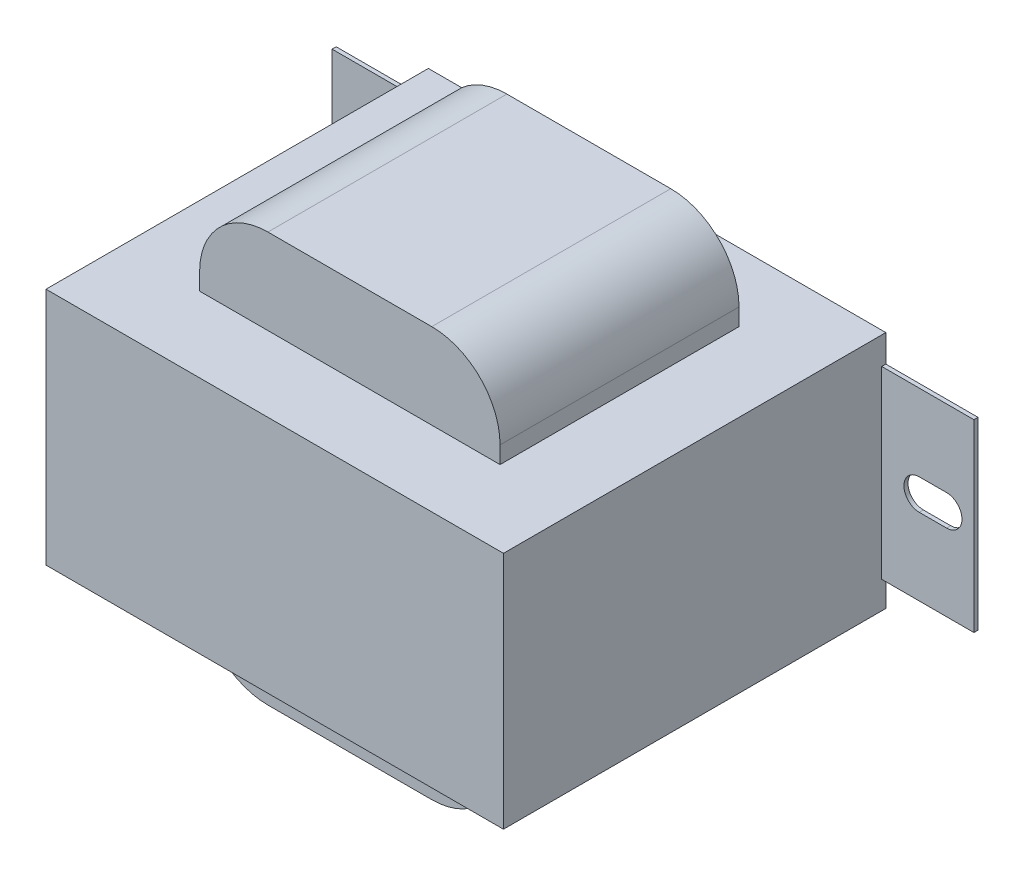
ISO-10303-21;
HEADER;
FILE_DESCRIPTION(('STEP AP214'),'2;1');
FILE_NAME('part.step','',(''),(''),'','','');
FILE_SCHEMA(('AUTOMOTIVE_DESIGN { 1 0 10303 214 1 1 1 1 }'));
ENDSEC;
DATA;
#1=APPLICATION_CONTEXT('core data for automotive mechanical design processes');
#2=APPLICATION_PROTOCOL_DEFINITION('international standard','automotive_design',2000,#1);
#3=PRODUCT_CONTEXT('',#1,'mechanical');
#4=PRODUCT('Part','Part','',(#3));
#5=PRODUCT_RELATED_PRODUCT_CATEGORY('part','',(#4));
#6=PRODUCT_DEFINITION_FORMATION('','',#4);
#7=PRODUCT_DEFINITION_CONTEXT('part definition',#1,'design');
#8=PRODUCT_DEFINITION('design','',#6,#7);
#9=PRODUCT_DEFINITION_SHAPE('','',#8);
#10=(LENGTH_UNIT() NAMED_UNIT(*) SI_UNIT(.MILLI.,.METRE.));
#11=(NAMED_UNIT(*) PLANE_ANGLE_UNIT() SI_UNIT($,.RADIAN.));
#12=(NAMED_UNIT(*) SI_UNIT($,.STERADIAN.) SOLID_ANGLE_UNIT());
#13=UNCERTAINTY_MEASURE_WITH_UNIT(LENGTH_MEASURE(1.E-05),#10,'distance_accuracy_value','');
#14=(GEOMETRIC_REPRESENTATION_CONTEXT(3) GLOBAL_UNCERTAINTY_ASSIGNED_CONTEXT((#13)) GLOBAL_UNIT_ASSIGNED_CONTEXT((#10,
#11,#12)) REPRESENTATION_CONTEXT('',''));
#15=CARTESIAN_POINT('',(0.,0.,0.));
#16=DIRECTION('',(0.,0.,1.));
#17=DIRECTION('',(1.,0.,0.));
#18=AXIS2_PLACEMENT_3D('',#15,#16,#17);
#19=CARTESIAN_POINT('',(-33.5,17.5,56.));
#20=DIRECTION('',(1.,0.,0.));
#21=DIRECTION('',(0.,1.,0.));
#22=AXIS2_PLACEMENT_3D('',#19,#20,#21);
#23=PLANE('',#22);
#24=DIRECTION('',(0.,0.,-1.));
#25=VECTOR('',#24,1.);
#26=CARTESIAN_POINT('',(-33.5,13.5,0.6));
#27=LINE('',#26,#25);
#28=CARTESIAN_POINT('',(-33.5,13.5,0.6));
#29=VERTEX_POINT('',#28);
#30=CARTESIAN_POINT('',(-33.5,13.5,0.));
#31=VERTEX_POINT('',#30);
#32=EDGE_CURVE('E299',#29,#31,#27,.T.);
#33=ORIENTED_EDGE('',*,*,#32,.F.);
#34=DIRECTION('',(0.,-1.,0.));
#35=VECTOR('',#34,1.);
#36=CARTESIAN_POINT('',(-33.5,13.5,0.6));
#37=LINE('',#36,#35);
#38=CARTESIAN_POINT('',(-33.5,-13.5,0.6));
#39=VERTEX_POINT('',#38);
#40=EDGE_CURVE('E289',#29,#39,#37,.T.);
#41=ORIENTED_EDGE('',*,*,#40,.T.);
#42=DIRECTION('',(0.,0.,-1.));
#43=VECTOR('',#42,1.);
#44=CARTESIAN_POINT('',(-33.5,-13.5,0.6));
#45=LINE('',#44,#43);
#46=CARTESIAN_POINT('',(-33.5,-13.5,0.));
#47=VERTEX_POINT('',#46);
#48=EDGE_CURVE('E307',#39,#47,#45,.T.);
#49=ORIENTED_EDGE('',*,*,#48,.T.);
#50=DIRECTION('',(0.,-1.,0.));
#51=VECTOR('',#50,1.);
#52=CARTESIAN_POINT('',(-33.5,17.5,0.));
#53=LINE('',#52,#51);
#54=CARTESIAN_POINT('',(-33.5,-17.5,0.));
#55=VERTEX_POINT('',#54);
#56=EDGE_CURVE('E327',#47,#55,#53,.T.);
#57=ORIENTED_EDGE('',*,*,#56,.T.);
#58=DIRECTION('',(0.,0.,-1.));
#59=VECTOR('',#58,1.);
#60=CARTESIAN_POINT('',(-33.5,-17.5,56.));
#61=LINE('',#60,#59);
#62=CARTESIAN_POINT('',(-33.5,-17.5,56.));
#63=VERTEX_POINT('',#62);
#64=EDGE_CURVE('E360',#63,#55,#61,.T.);
#65=ORIENTED_EDGE('',*,*,#64,.F.);
#66=DIRECTION('',(0.,-1.,0.));
#67=VECTOR('',#66,1.);
#68=CARTESIAN_POINT('',(-33.5,17.5,56.));
#69=LINE('',#68,#67);
#70=CARTESIAN_POINT('',(-33.5,17.5,56.));
#71=VERTEX_POINT('',#70);
#72=EDGE_CURVE('E377',#71,#63,#69,.T.);
#73=ORIENTED_EDGE('',*,*,#72,.F.);
#74=DIRECTION('',(0.,0.,-1.));
#75=VECTOR('',#74,1.);
#76=CARTESIAN_POINT('',(-33.5,17.5,56.));
#77=LINE('',#76,#75);
#78=CARTESIAN_POINT('',(-33.5,17.5,0.));
#79=VERTEX_POINT('',#78);
#80=EDGE_CURVE('E369',#71,#79,#77,.T.);
#81=ORIENTED_EDGE('',*,*,#80,.T.);
#82=EDGE_CURVE('E330',#79,#31,#53,.T.);
#83=ORIENTED_EDGE('',*,*,#82,.T.);
#84=EDGE_LOOP('',(#33,#41,#49,#57,#65,#73,#81,#83));
#85=FACE_BOUND('',#84,.T.);
#86=ADVANCED_FACE('F33',(#85),#23,.F.);
#87=CARTESIAN_POINT('',(33.5,17.5,56.));
#88=DIRECTION('',(-1.,0.,0.));
#89=DIRECTION('',(0.,0.,1.));
#90=AXIS2_PLACEMENT_3D('',#87,#88,#89);
#91=PLANE('',#90);
#92=DIRECTION('',(0.,0.,-1.));
#93=VECTOR('',#92,1.);
#94=CARTESIAN_POINT('',(33.5,-13.5,0.6));
#95=LINE('',#94,#93);
#96=CARTESIAN_POINT('',(33.5,-13.5,0.6));
#97=VERTEX_POINT('',#96);
#98=CARTESIAN_POINT('',(33.5,-13.5,0.));
#99=VERTEX_POINT('',#98);
#100=EDGE_CURVE('E831',#97,#99,#95,.T.);
#101=ORIENTED_EDGE('',*,*,#100,.F.);
#102=DIRECTION('',(0.,1.,0.));
#103=VECTOR('',#102,1.);
#104=CARTESIAN_POINT('',(33.5,13.5,0.6));
#105=LINE('',#104,#103);
#106=CARTESIAN_POINT('',(33.5,13.5,0.6));
#107=VERTEX_POINT('',#106);
#108=EDGE_CURVE('E864',#97,#107,#105,.T.);
#109=ORIENTED_EDGE('',*,*,#108,.T.);
#110=DIRECTION('',(0.,0.,-1.));
#111=VECTOR('',#110,1.);
#112=CARTESIAN_POINT('',(33.5,13.5,0.6));
#113=LINE('',#112,#111);
#114=CARTESIAN_POINT('',(33.5,13.5,0.));
#115=VERTEX_POINT('',#114);
#116=EDGE_CURVE('E853',#107,#115,#113,.T.);
#117=ORIENTED_EDGE('',*,*,#116,.T.);
#118=DIRECTION('',(0.,1.,0.));
#119=VECTOR('',#118,1.);
#120=CARTESIAN_POINT('',(33.5,17.5,0.));
#121=LINE('',#120,#119);
#122=CARTESIAN_POINT('',(33.5,17.5,0.));
#123=VERTEX_POINT('',#122);
#124=EDGE_CURVE('E340',#115,#123,#121,.T.);
#125=ORIENTED_EDGE('',*,*,#124,.T.);
#126=DIRECTION('',(0.,0.,-1.));
#127=VECTOR('',#126,1.);
#128=CARTESIAN_POINT('',(33.5,17.5,56.));
#129=LINE('',#128,#127);
#130=CARTESIAN_POINT('',(33.5,17.5,56.));
#131=VERTEX_POINT('',#130);
#132=EDGE_CURVE('E366',#131,#123,#129,.T.);
#133=ORIENTED_EDGE('',*,*,#132,.F.);
#134=DIRECTION('',(0.,1.,0.));
#135=VECTOR('',#134,1.);
#136=CARTESIAN_POINT('',(33.5,17.5,56.));
#137=LINE('',#136,#135);
#138=CARTESIAN_POINT('',(33.5,-17.5,56.));
#139=VERTEX_POINT('',#138);
#140=EDGE_CURVE('E374',#139,#131,#137,.T.);
#141=ORIENTED_EDGE('',*,*,#140,.F.);
#142=DIRECTION('',(0.,0.,-1.));
#143=VECTOR('',#142,1.);
#144=CARTESIAN_POINT('',(33.5,-17.5,56.));
#145=LINE('',#144,#143);
#146=CARTESIAN_POINT('',(33.5,-17.5,0.));
#147=VERTEX_POINT('',#146);
#148=EDGE_CURVE('E363',#139,#147,#145,.T.);
#149=ORIENTED_EDGE('',*,*,#148,.T.);
#150=EDGE_CURVE('E349',#147,#99,#121,.T.);
#151=ORIENTED_EDGE('',*,*,#150,.T.);
#152=EDGE_LOOP('',(#101,#109,#117,#125,#133,#141,#149,#151));
#153=FACE_BOUND('',#152,.T.);
#154=ADVANCED_FACE('F419',(#153),#91,.F.);
#155=CARTESIAN_POINT('',(-33.5,-17.5,56.));
#156=DIRECTION('',(0.,1.,0.));
#157=DIRECTION('',(-1.,0.,0.));
#158=AXIS2_PLACEMENT_3D('',#155,#156,#157);
#159=PLANE('',#158);
#160=DIRECTION('',(1.,0.,0.));
#161=VECTOR('',#160,1.);
#162=CARTESIAN_POINT('',(-33.5,-17.5,0.));
#163=LINE('',#162,#161);
#164=EDGE_CURVE('E337',#55,#147,#163,.T.);
#165=ORIENTED_EDGE('',*,*,#164,.T.);
#166=ORIENTED_EDGE('',*,*,#148,.F.);
#167=DIRECTION('',(1.,0.,0.));
#168=VECTOR('',#167,1.);
#169=CARTESIAN_POINT('',(-33.5,-17.5,56.));
#170=LINE('',#169,#168);
#171=EDGE_CURVE('E376',#63,#139,#170,.T.);
#172=ORIENTED_EDGE('',*,*,#171,.F.);
#173=ORIENTED_EDGE('',*,*,#64,.T.);
#174=EDGE_LOOP('',(#165,#166,#172,#173));
#175=FACE_BOUND('',#174,.T.);
#176=DIRECTION('',(1.,0.,0.));
#177=VECTOR('',#176,1.);
#178=CARTESIAN_POINT('',(-33.5,-17.5,9.99999999999999));
#179=LINE('',#178,#177);
#180=CARTESIAN_POINT('',(-22.,-17.5,9.99999999999999));
#181=VERTEX_POINT('',#180);
#182=CARTESIAN_POINT('',(22.,-17.5,9.99999999999999));
#183=VERTEX_POINT('',#182);
#184=EDGE_CURVE('E803',#181,#183,#179,.T.);
#185=ORIENTED_EDGE('',*,*,#184,.F.);
#186=DIRECTION('',(0.,0.,1.));
#187=VECTOR('',#186,1.);
#188=CARTESIAN_POINT('',(-22.,-17.5,56.));
#189=LINE('',#188,#187);
#190=CARTESIAN_POINT('',(-22.,-17.5,45.));
#191=VERTEX_POINT('',#190);
#192=EDGE_CURVE('E804',#181,#191,#189,.T.);
#193=ORIENTED_EDGE('',*,*,#192,.T.);
#194=DIRECTION('',(1.,0.,0.));
#195=VECTOR('',#194,1.);
#196=CARTESIAN_POINT('',(-33.5,-17.5,45.));
#197=LINE('',#196,#195);
#198=CARTESIAN_POINT('',(22.,-17.5,45.));
#199=VERTEX_POINT('',#198);
#200=EDGE_CURVE('E786',#191,#199,#197,.T.);
#201=ORIENTED_EDGE('',*,*,#200,.T.);
#202=DIRECTION('',(0.,0.,-1.));
#203=VECTOR('',#202,1.);
#204=CARTESIAN_POINT('',(22.,-17.5,56.));
#205=LINE('',#204,#203);
#206=EDGE_CURVE('E331',#199,#183,#205,.T.);
#207=ORIENTED_EDGE('',*,*,#206,.T.);
#208=EDGE_LOOP('',(#185,#193,#201,#207));
#209=FACE_BOUND('',#208,.T.);
#210=ADVANCED_FACE('F423',(#175,#209),#159,.F.);
#211=CARTESIAN_POINT('',(-33.5,17.5,56.));
#212=DIRECTION('',(0.,-1.,0.));
#213=DIRECTION('',(0.,0.,-1.));
#214=AXIS2_PLACEMENT_3D('',#211,#212,#213);
#215=PLANE('',#214);
#216=DIRECTION('',(-1.,0.,0.));
#217=VECTOR('',#216,1.);
#218=CARTESIAN_POINT('',(-33.5,17.5,0.));
#219=LINE('',#218,#217);
#220=EDGE_CURVE('E343',#123,#79,#219,.T.);
#221=ORIENTED_EDGE('',*,*,#220,.T.);
#222=ORIENTED_EDGE('',*,*,#80,.F.);
#223=DIRECTION('',(-1.,0.,0.));
#224=VECTOR('',#223,1.);
#225=CARTESIAN_POINT('',(-33.5,17.5,56.));
#226=LINE('',#225,#224);
#227=EDGE_CURVE('E372',#131,#71,#226,.T.);
#228=ORIENTED_EDGE('',*,*,#227,.F.);
#229=ORIENTED_EDGE('',*,*,#132,.T.);
#230=EDGE_LOOP('',(#221,#222,#228,#229));
#231=FACE_BOUND('',#230,.T.);
#232=DIRECTION('',(-1.,0.,0.));
#233=VECTOR('',#232,1.);
#234=CARTESIAN_POINT('',(-33.5,17.5,9.99999999999999));
#235=LINE('',#234,#233);
#236=CARTESIAN_POINT('',(22.,17.5,9.99999999999999));
#237=VERTEX_POINT('',#236);
#238=CARTESIAN_POINT('',(-22.,17.5,9.99999999999999));
#239=VERTEX_POINT('',#238);
#240=EDGE_CURVE('E11',#237,#239,#235,.T.);
#241=ORIENTED_EDGE('',*,*,#240,.F.);
#242=DIRECTION('',(0.,0.,1.));
#243=VECTOR('',#242,1.);
#244=CARTESIAN_POINT('',(22.,17.5,56.));
#245=LINE('',#244,#243);
#246=CARTESIAN_POINT('',(22.,17.5,45.));
#247=VERTEX_POINT('',#246);
#248=EDGE_CURVE('E41',#237,#247,#245,.T.);
#249=ORIENTED_EDGE('',*,*,#248,.T.);
#250=DIRECTION('',(-1.,0.,0.));
#251=VECTOR('',#250,1.);
#252=CARTESIAN_POINT('',(-33.5,17.5,45.));
#253=LINE('',#252,#251);
#254=CARTESIAN_POINT('',(-22.,17.5,45.));
#255=VERTEX_POINT('',#254);
#256=EDGE_CURVE('E357',#247,#255,#253,.T.);
#257=ORIENTED_EDGE('',*,*,#256,.T.);
#258=DIRECTION('',(0.,0.,-1.));
#259=VECTOR('',#258,1.);
#260=CARTESIAN_POINT('',(-22.,17.5,56.));
#261=LINE('',#260,#259);
#262=EDGE_CURVE('E354',#255,#239,#261,.T.);
#263=ORIENTED_EDGE('',*,*,#262,.T.);
#264=EDGE_LOOP('',(#241,#249,#257,#263));
#265=FACE_BOUND('',#264,.T.);
#266=ADVANCED_FACE('F385',(#231,#265),#215,.F.);
#267=CARTESIAN_POINT('',(-33.5,-17.5,56.));
#268=DIRECTION('',(0.,0.,1.));
#269=DIRECTION('',(1.,0.,0.));
#270=AXIS2_PLACEMENT_3D('',#267,#268,#269);
#271=PLANE('',#270);
#272=ORIENTED_EDGE('',*,*,#72,.T.);
#273=ORIENTED_EDGE('',*,*,#171,.T.);
#274=ORIENTED_EDGE('',*,*,#140,.T.);
#275=ORIENTED_EDGE('',*,*,#227,.T.);
#276=EDGE_LOOP('',(#272,#273,#274,#275));
#277=FACE_BOUND('',#276,.T.);
#278=ADVANCED_FACE('F396',(#277),#271,.T.);
#279=CARTESIAN_POINT('',(-33.5,-17.5,0.));
#280=DIRECTION('',(0.,0.,1.));
#281=DIRECTION('',(1.,0.,0.));
#282=AXIS2_PLACEMENT_3D('',#279,#280,#281);
#283=PLANE('',#282);
#284=ORIENTED_EDGE('',*,*,#82,.F.);
#285=ORIENTED_EDGE('',*,*,#220,.F.);
#286=ORIENTED_EDGE('',*,*,#124,.F.);
#287=DIRECTION('',(1.,0.,0.));
#288=VECTOR('',#287,1.);
#289=CARTESIAN_POINT('',(33.5,13.5,0.));
#290=LINE('',#289,#288);
#291=CARTESIAN_POINT('',(47.,13.5,0.));
#292=VERTEX_POINT('',#291);
#293=EDGE_CURVE('E57',#115,#292,#290,.T.);
#294=ORIENTED_EDGE('',*,*,#293,.T.);
#295=DIRECTION('',(0.,-1.,0.));
#296=VECTOR('',#295,1.);
#297=CARTESIAN_POINT('',(47.,13.5,0.));
#298=LINE('',#297,#296);
#299=CARTESIAN_POINT('',(47.,-13.5,0.));
#300=VERTEX_POINT('',#299);
#301=EDGE_CURVE('E865',#292,#300,#298,.T.);
#302=ORIENTED_EDGE('',*,*,#301,.T.);
#303=DIRECTION('',(-1.,0.,0.));
#304=VECTOR('',#303,1.);
#305=CARTESIAN_POINT('',(33.5,-13.5,0.));
#306=LINE('',#305,#304);
#307=EDGE_CURVE('E862',#300,#99,#306,.T.);
#308=ORIENTED_EDGE('',*,*,#307,.T.);
#309=ORIENTED_EDGE('',*,*,#150,.F.);
#310=ORIENTED_EDGE('',*,*,#164,.F.);
#311=ORIENTED_EDGE('',*,*,#56,.F.);
#312=DIRECTION('',(-1.,0.,0.));
#313=VECTOR('',#312,1.);
#314=CARTESIAN_POINT('',(-33.5,-13.5,0.));
#315=LINE('',#314,#313);
#316=CARTESIAN_POINT('',(-47.,-13.5,0.));
#317=VERTEX_POINT('',#316);
#318=EDGE_CURVE('E49',#47,#317,#315,.T.);
#319=ORIENTED_EDGE('',*,*,#318,.T.);
#320=DIRECTION('',(0.,1.,0.));
#321=VECTOR('',#320,1.);
#322=CARTESIAN_POINT('',(-47.,13.5,0.));
#323=LINE('',#322,#321);
#324=CARTESIAN_POINT('',(-47.,13.5,0.));
#325=VERTEX_POINT('',#324);
#326=EDGE_CURVE('E290',#317,#325,#323,.T.);
#327=ORIENTED_EDGE('',*,*,#326,.T.);
#328=DIRECTION('',(1.,0.,0.));
#329=VECTOR('',#328,1.);
#330=CARTESIAN_POINT('',(-33.5,13.5,0.));
#331=LINE('',#330,#329);
#332=EDGE_CURVE('E282',#325,#31,#331,.T.);
#333=ORIENTED_EDGE('',*,*,#332,.T.);
#334=EDGE_LOOP('',(#284,#285,#286,#294,#302,#308,#309,#310,#311,#319,#327,#333));
#335=FACE_BOUND('',#334,.T.);
#336=DIRECTION('',(-1.,0.,0.));
#337=VECTOR('',#336,1.);
#338=CARTESIAN_POINT('',(43.,-2.25000000000002,0.));
#339=LINE('',#338,#337);
#340=CARTESIAN_POINT('',(43.,-2.25000000000002,0.));
#341=VERTEX_POINT('',#340);
#342=CARTESIAN_POINT('',(39.,-2.24999999999999,0.));
#343=VERTEX_POINT('',#342);
#344=EDGE_CURVE('E403',#341,#343,#339,.T.);
#345=ORIENTED_EDGE('',*,*,#344,.F.);
#346=CARTESIAN_POINT('',(43.,0.,0.));
#347=DIRECTION('',(0.,0.,-1.));
#348=DIRECTION('',(-1.,0.,0.));
#349=AXIS2_PLACEMENT_3D('',#346,#347,#348);
#350=CIRCLE('',#349,2.25);
#351=CARTESIAN_POINT('',(43.,2.24999999999998,0.));
#352=VERTEX_POINT('',#351);
#353=EDGE_CURVE('E304',#352,#341,#350,.T.);
#354=ORIENTED_EDGE('',*,*,#353,.F.);
#355=DIRECTION('',(1.,0.,0.));
#356=VECTOR('',#355,1.);
#357=CARTESIAN_POINT('',(43.,2.24999999999998,0.));
#358=LINE('',#357,#356);
#359=CARTESIAN_POINT('',(39.,2.24999999999999,0.));
#360=VERTEX_POINT('',#359);
#361=EDGE_CURVE('E898',#360,#352,#358,.T.);
#362=ORIENTED_EDGE('',*,*,#361,.F.);
#363=CARTESIAN_POINT('',(39.,0.,0.));
#364=DIRECTION('',(0.,0.,-1.));
#365=DIRECTION('',(-1.,0.,0.));
#366=AXIS2_PLACEMENT_3D('',#363,#364,#365);
#367=CIRCLE('',#366,2.24999999999999);
#368=EDGE_CURVE('E901',#343,#360,#367,.T.);
#369=ORIENTED_EDGE('',*,*,#368,.F.);
#370=EDGE_LOOP('',(#345,#354,#362,#369));
#371=FACE_BOUND('',#370,.T.);
#372=DIRECTION('',(1.,0.,0.));
#373=VECTOR('',#372,1.);
#374=CARTESIAN_POINT('',(-43.,2.25000000000001,0.));
#375=LINE('',#374,#373);
#376=CARTESIAN_POINT('',(-43.,2.25000000000001,0.));
#377=VERTEX_POINT('',#376);
#378=CARTESIAN_POINT('',(-39.,2.25000000000001,0.));
#379=VERTEX_POINT('',#378);
#380=EDGE_CURVE('E276',#377,#379,#375,.T.);
#381=ORIENTED_EDGE('',*,*,#380,.F.);
#382=CARTESIAN_POINT('',(-43.,0.,0.));
#383=DIRECTION('',(0.,0.,-1.));
#384=DIRECTION('',(1.,0.,0.));
#385=AXIS2_PLACEMENT_3D('',#382,#383,#384);
#386=CIRCLE('',#385,2.25);
#387=CARTESIAN_POINT('',(-43.,-2.24999999999999,0.));
#388=VERTEX_POINT('',#387);
#389=EDGE_CURVE('E249',#388,#377,#386,.T.);
#390=ORIENTED_EDGE('',*,*,#389,.F.);
#391=DIRECTION('',(-1.,0.,0.));
#392=VECTOR('',#391,1.);
#393=CARTESIAN_POINT('',(-43.,-2.24999999999999,0.));
#394=LINE('',#393,#392);
#395=CARTESIAN_POINT('',(-39.,-2.24999999999999,0.));
#396=VERTEX_POINT('',#395);
#397=EDGE_CURVE('E267',#396,#388,#394,.T.);
#398=ORIENTED_EDGE('',*,*,#397,.F.);
#399=CARTESIAN_POINT('',(-39.,0.,0.));
#400=DIRECTION('',(0.,0.,-1.));
#401=DIRECTION('',(1.,0.,0.));
#402=AXIS2_PLACEMENT_3D('',#399,#400,#401);
#403=CIRCLE('',#402,2.25);
#404=EDGE_CURVE('E270',#379,#396,#403,.T.);
#405=ORIENTED_EDGE('',*,*,#404,.F.);
#406=EDGE_LOOP('',(#381,#390,#398,#405));
#407=FACE_BOUND('',#406,.T.);
#408=ADVANCED_FACE('F392',(#335,#371,#407),#283,.F.);
#409=CARTESIAN_POINT('',(-12.,20.,9.99999999999999));
#410=DIRECTION('',(0.,0.,1.));
#411=DIRECTION('',(1.,0.,0.));
#412=AXIS2_PLACEMENT_3D('',#409,#410,#411);
#413=CYLINDRICAL_SURFACE('',#412,9.99999999999999);
#414=CARTESIAN_POINT('',(-12.,20.,45.));
#415=DIRECTION('',(0.,0.,1.));
#416=DIRECTION('',(1.,0.,0.));
#417=AXIS2_PLACEMENT_3D('',#414,#415,#416);
#418=CIRCLE('',#417,9.99999999999999);
#419=CARTESIAN_POINT('',(-12.,30.,45.));
#420=VERTEX_POINT('',#419);
#421=CARTESIAN_POINT('',(-22.,20.,45.));
#422=VERTEX_POINT('',#421);
#423=EDGE_CURVE('E829',#420,#422,#418,.T.);
#424=ORIENTED_EDGE('',*,*,#423,.F.);
#425=DIRECTION('',(0.,0.,1.));
#426=VECTOR('',#425,1.);
#427=CARTESIAN_POINT('',(-12.,30.,9.99999999999999));
#428=LINE('',#427,#426);
#429=CARTESIAN_POINT('',(-12.,30.,9.99999999999999));
#430=VERTEX_POINT('',#429);
#431=EDGE_CURVE('E784',#430,#420,#428,.T.);
#432=ORIENTED_EDGE('',*,*,#431,.F.);
#433=CARTESIAN_POINT('',(-12.,20.,9.99999999999999));
#434=DIRECTION('',(0.,0.,1.));
#435=DIRECTION('',(1.,0.,0.));
#436=AXIS2_PLACEMENT_3D('',#433,#434,#435);
#437=CIRCLE('',#436,9.99999999999999);
#438=CARTESIAN_POINT('',(-22.,20.,9.99999999999999));
#439=VERTEX_POINT('',#438);
#440=EDGE_CURVE('E771',#430,#439,#437,.T.);
#441=ORIENTED_EDGE('',*,*,#440,.T.);
#442=DIRECTION('',(0.,0.,1.));
#443=VECTOR('',#442,1.);
#444=CARTESIAN_POINT('',(-22.,20.,9.99999999999999));
#445=LINE('',#444,#443);
#446=EDGE_CURVE('E762',#439,#422,#445,.T.);
#447=ORIENTED_EDGE('',*,*,#446,.T.);
#448=EDGE_LOOP('',(#424,#432,#441,#447));
#449=FACE_BOUND('',#448,.T.);
#450=ADVANCED_FACE('F395',(#449),#413,.T.);
#451=CARTESIAN_POINT('',(-12.,30.,9.99999999999999));
#452=DIRECTION('',(0.,1.,0.));
#453=DIRECTION('',(0.,0.,1.));
#454=AXIS2_PLACEMENT_3D('',#451,#452,#453);
#455=PLANE('',#454);
#456=DIRECTION('',(-1.,0.,0.));
#457=VECTOR('',#456,1.);
#458=CARTESIAN_POINT('',(-12.,30.,45.));
#459=LINE('',#458,#457);
#460=CARTESIAN_POINT('',(12.,30.,45.));
#461=VERTEX_POINT('',#460);
#462=EDGE_CURVE('E842',#461,#420,#459,.T.);
#463=ORIENTED_EDGE('',*,*,#462,.F.);
#464=DIRECTION('',(0.,0.,1.));
#465=VECTOR('',#464,1.);
#466=CARTESIAN_POINT('',(12.,30.,9.99999999999999));
#467=LINE('',#466,#465);
#468=CARTESIAN_POINT('',(12.,30.,9.99999999999999));
#469=VERTEX_POINT('',#468);
#470=EDGE_CURVE('E787',#469,#461,#467,.T.);
#471=ORIENTED_EDGE('',*,*,#470,.F.);
#472=DIRECTION('',(-1.,0.,0.));
#473=VECTOR('',#472,1.);
#474=CARTESIAN_POINT('',(-12.,30.,9.99999999999999));
#475=LINE('',#474,#473);
#476=EDGE_CURVE('E781',#469,#430,#475,.T.);
#477=ORIENTED_EDGE('',*,*,#476,.T.);
#478=ORIENTED_EDGE('',*,*,#431,.T.);
#479=EDGE_LOOP('',(#463,#471,#477,#478));
#480=FACE_BOUND('',#479,.T.);
#481=ADVANCED_FACE('F438',(#480),#455,.T.);
#482=CARTESIAN_POINT('',(12.,20.,9.99999999999999));
#483=DIRECTION('',(0.,0.,1.));
#484=DIRECTION('',(1.,0.,0.));
#485=AXIS2_PLACEMENT_3D('',#482,#483,#484);
#486=CYLINDRICAL_SURFACE('',#485,9.99999999999999);
#487=CARTESIAN_POINT('',(12.,20.,45.));
#488=DIRECTION('',(0.,0.,1.));
#489=DIRECTION('',(-1.,0.,0.));
#490=AXIS2_PLACEMENT_3D('',#487,#488,#489);
#491=CIRCLE('',#490,9.99999999999999);
#492=CARTESIAN_POINT('',(22.,20.,45.));
#493=VERTEX_POINT('',#492);
#494=EDGE_CURVE('E840',#493,#461,#491,.T.);
#495=ORIENTED_EDGE('',*,*,#494,.F.);
#496=DIRECTION('',(0.,0.,1.));
#497=VECTOR('',#496,1.);
#498=CARTESIAN_POINT('',(22.,20.,9.99999999999999));
#499=LINE('',#498,#497);
#500=CARTESIAN_POINT('',(22.,20.,9.99999999999999));
#501=VERTEX_POINT('',#500);
#502=EDGE_CURVE('E789',#501,#493,#499,.T.);
#503=ORIENTED_EDGE('',*,*,#502,.F.);
#504=CARTESIAN_POINT('',(12.,20.,9.99999999999999));
#505=DIRECTION('',(0.,0.,1.));
#506=DIRECTION('',(-1.,0.,0.));
#507=AXIS2_PLACEMENT_3D('',#504,#505,#506);
#508=CIRCLE('',#507,9.99999999999999);
#509=EDGE_CURVE('E751',#501,#469,#508,.T.);
#510=ORIENTED_EDGE('',*,*,#509,.T.);
#511=ORIENTED_EDGE('',*,*,#470,.T.);
#512=EDGE_LOOP('',(#495,#503,#510,#511));
#513=FACE_BOUND('',#512,.T.);
#514=ADVANCED_FACE('F465',(#513),#486,.T.);
#515=CARTESIAN_POINT('',(-12.,20.,9.99999999999999));
#516=DIRECTION('',(0.,0.,1.));
#517=DIRECTION('',(1.,0.,0.));
#518=AXIS2_PLACEMENT_3D('',#515,#516,#517);
#519=PLANE('',#518);
#520=DIRECTION('',(0.,1.,0.));
#521=VECTOR('',#520,1.);
#522=CARTESIAN_POINT('',(22.,20.,9.99999999999999));
#523=LINE('',#522,#521);
#524=EDGE_CURVE('E745',#237,#501,#523,.T.);
#525=ORIENTED_EDGE('',*,*,#524,.F.);
#526=ORIENTED_EDGE('',*,*,#240,.T.);
#527=DIRECTION('',(0.,-1.,0.));
#528=VECTOR('',#527,1.);
#529=CARTESIAN_POINT('',(-22.,20.,9.99999999999999));
#530=LINE('',#529,#528);
#531=EDGE_CURVE('E761',#439,#239,#530,.T.);
#532=ORIENTED_EDGE('',*,*,#531,.F.);
#533=ORIENTED_EDGE('',*,*,#440,.F.);
#534=ORIENTED_EDGE('',*,*,#476,.F.);
#535=ORIENTED_EDGE('',*,*,#509,.F.);
#536=EDGE_LOOP('',(#525,#526,#532,#533,#534,#535));
#537=FACE_BOUND('',#536,.T.);
#538=ADVANCED_FACE('F468',(#537),#519,.F.);
#539=CARTESIAN_POINT('',(-12.,20.,45.));
#540=DIRECTION('',(0.,0.,1.));
#541=DIRECTION('',(1.,0.,0.));
#542=AXIS2_PLACEMENT_3D('',#539,#540,#541);
#543=PLANE('',#542);
#544=ORIENTED_EDGE('',*,*,#256,.F.);
#545=DIRECTION('',(0.,1.,0.));
#546=VECTOR('',#545,1.);
#547=CARTESIAN_POINT('',(22.,20.,45.));
#548=LINE('',#547,#546);
#549=EDGE_CURVE('E838',#247,#493,#548,.T.);
#550=ORIENTED_EDGE('',*,*,#549,.T.);
#551=ORIENTED_EDGE('',*,*,#494,.T.);
#552=ORIENTED_EDGE('',*,*,#462,.T.);
#553=ORIENTED_EDGE('',*,*,#423,.T.);
#554=DIRECTION('',(0.,-1.,0.));
#555=VECTOR('',#554,1.);
#556=CARTESIAN_POINT('',(-22.,20.,45.));
#557=LINE('',#556,#555);
#558=EDGE_CURVE('E759',#422,#255,#557,.T.);
#559=ORIENTED_EDGE('',*,*,#558,.T.);
#560=EDGE_LOOP('',(#544,#550,#551,#552,#553,#559));
#561=FACE_BOUND('',#560,.T.);
#562=ADVANCED_FACE('F479',(#561),#543,.T.);
#563=CARTESIAN_POINT('',(-22.,20.,9.99999999999999));
#564=DIRECTION('',(-1.,0.,0.));
#565=DIRECTION('',(0.,0.,1.));
#566=AXIS2_PLACEMENT_3D('',#563,#564,#565);
#567=PLANE('',#566);
#568=ORIENTED_EDGE('',*,*,#262,.F.);
#569=ORIENTED_EDGE('',*,*,#558,.F.);
#570=ORIENTED_EDGE('',*,*,#446,.F.);
#571=ORIENTED_EDGE('',*,*,#531,.T.);
#572=EDGE_LOOP('',(#568,#569,#570,#571));
#573=FACE_BOUND('',#572,.T.);
#574=ADVANCED_FACE('F446',(#573),#567,.T.);
#575=CARTESIAN_POINT('',(22.,20.,9.99999999999999));
#576=DIRECTION('',(1.,0.,0.));
#577=DIRECTION('',(0.,1.,0.));
#578=AXIS2_PLACEMENT_3D('',#575,#576,#577);
#579=PLANE('',#578);
#580=ORIENTED_EDGE('',*,*,#248,.F.);
#581=ORIENTED_EDGE('',*,*,#524,.T.);
#582=ORIENTED_EDGE('',*,*,#502,.T.);
#583=ORIENTED_EDGE('',*,*,#549,.F.);
#584=EDGE_LOOP('',(#580,#581,#582,#583));
#585=FACE_BOUND('',#584,.T.);
#586=ADVANCED_FACE('F463',(#585),#579,.T.);
#587=ORIENTED_EDGE('',*,*,#206,.F.);
#588=CARTESIAN_POINT('',(22.,-19.9999999999999,45.));
#589=VERTEX_POINT('',#588);
#590=EDGE_CURVE('E811',#589,#199,#548,.T.);
#591=ORIENTED_EDGE('',*,*,#590,.F.);
#592=DIRECTION('',(0.,0.,1.));
#593=VECTOR('',#592,1.);
#594=CARTESIAN_POINT('',(22.,-19.9999999999999,9.99999999999999));
#595=LINE('',#594,#593);
#596=CARTESIAN_POINT('',(22.,-19.9999999999999,9.99999999999999));
#597=VERTEX_POINT('',#596);
#598=EDGE_CURVE('E791',#597,#589,#595,.T.);
#599=ORIENTED_EDGE('',*,*,#598,.F.);
#600=EDGE_CURVE('E754',#597,#183,#523,.T.);
#601=ORIENTED_EDGE('',*,*,#600,.T.);
#602=EDGE_LOOP('',(#587,#591,#599,#601));
#603=FACE_BOUND('',#602,.T.);
#604=ADVANCED_FACE('F444',(#603),#579,.T.);
#605=ORIENTED_EDGE('',*,*,#192,.F.);
#606=CARTESIAN_POINT('',(-22.,-20.,9.99999999999999));
#607=VERTEX_POINT('',#606);
#608=EDGE_CURVE('E766',#181,#607,#530,.T.);
#609=ORIENTED_EDGE('',*,*,#608,.T.);
#610=DIRECTION('',(0.,0.,1.));
#611=VECTOR('',#610,1.);
#612=CARTESIAN_POINT('',(-22.,-20.,9.99999999999999));
#613=LINE('',#612,#611);
#614=CARTESIAN_POINT('',(-22.,-20.,45.));
#615=VERTEX_POINT('',#614);
#616=EDGE_CURVE('E797',#607,#615,#613,.T.);
#617=ORIENTED_EDGE('',*,*,#616,.T.);
#618=EDGE_CURVE('E828',#191,#615,#557,.T.);
#619=ORIENTED_EDGE('',*,*,#618,.F.);
#620=EDGE_LOOP('',(#605,#609,#617,#619));
#621=FACE_BOUND('',#620,.T.);
#622=ADVANCED_FACE('F440',(#621),#567,.T.);
#623=ORIENTED_EDGE('',*,*,#608,.F.);
#624=ORIENTED_EDGE('',*,*,#184,.T.);
#625=ORIENTED_EDGE('',*,*,#600,.F.);
#626=CARTESIAN_POINT('',(12.,-20.,9.99999999999999));
#627=DIRECTION('',(0.,0.,1.));
#628=DIRECTION('',(1.,0.,0.));
#629=AXIS2_PLACEMENT_3D('',#626,#627,#628);
#630=CIRCLE('',#629,10.);
#631=CARTESIAN_POINT('',(11.9999999999999,-30.,9.99999999999999));
#632=VERTEX_POINT('',#631);
#633=EDGE_CURVE('E755',#632,#597,#630,.T.);
#634=ORIENTED_EDGE('',*,*,#633,.F.);
#635=DIRECTION('',(1.,0.,0.));
#636=VECTOR('',#635,1.);
#637=CARTESIAN_POINT('',(-12.,-30.,9.99999999999999));
#638=LINE('',#637,#636);
#639=CARTESIAN_POINT('',(-12.,-30.,9.99999999999999));
#640=VERTEX_POINT('',#639);
#641=EDGE_CURVE('E769',#640,#632,#638,.T.);
#642=ORIENTED_EDGE('',*,*,#641,.F.);
#643=CARTESIAN_POINT('',(-12.,-20.,9.99999999999999));
#644=DIRECTION('',(0.,0.,1.));
#645=DIRECTION('',(1.,0.,0.));
#646=AXIS2_PLACEMENT_3D('',#643,#644,#645);
#647=CIRCLE('',#646,9.99999999999999);
#648=EDGE_CURVE('E765',#607,#640,#647,.T.);
#649=ORIENTED_EDGE('',*,*,#648,.F.);
#650=EDGE_LOOP('',(#623,#624,#625,#634,#642,#649));
#651=FACE_BOUND('',#650,.T.);
#652=ADVANCED_FACE('F443',(#651),#519,.F.);
#653=ORIENTED_EDGE('',*,*,#200,.F.);
#654=ORIENTED_EDGE('',*,*,#618,.T.);
#655=CARTESIAN_POINT('',(-12.,-20.,45.));
#656=DIRECTION('',(0.,0.,1.));
#657=DIRECTION('',(1.,0.,0.));
#658=AXIS2_PLACEMENT_3D('',#655,#656,#657);
#659=CIRCLE('',#658,9.99999999999999);
#660=CARTESIAN_POINT('',(-12.,-30.,45.));
#661=VERTEX_POINT('',#660);
#662=EDGE_CURVE('E826',#615,#661,#659,.T.);
#663=ORIENTED_EDGE('',*,*,#662,.T.);
#664=DIRECTION('',(1.,0.,0.));
#665=VECTOR('',#664,1.);
#666=CARTESIAN_POINT('',(-12.,-30.,45.));
#667=LINE('',#666,#665);
#668=CARTESIAN_POINT('',(11.9999999999999,-30.,45.));
#669=VERTEX_POINT('',#668);
#670=EDGE_CURVE('E821',#661,#669,#667,.T.);
#671=ORIENTED_EDGE('',*,*,#670,.T.);
#672=CARTESIAN_POINT('',(12.,-20.,45.));
#673=DIRECTION('',(0.,0.,1.));
#674=DIRECTION('',(1.,0.,0.));
#675=AXIS2_PLACEMENT_3D('',#672,#673,#674);
#676=CIRCLE('',#675,10.);
#677=EDGE_CURVE('E818',#669,#589,#676,.T.);
#678=ORIENTED_EDGE('',*,*,#677,.T.);
#679=ORIENTED_EDGE('',*,*,#590,.T.);
#680=EDGE_LOOP('',(#653,#654,#663,#671,#678,#679));
#681=FACE_BOUND('',#680,.T.);
#682=ADVANCED_FACE('F459',(#681),#543,.T.);
#683=CARTESIAN_POINT('',(12.,-20.,9.99999999999999));
#684=DIRECTION('',(0.,0.,1.));
#685=DIRECTION('',(1.,0.,0.));
#686=AXIS2_PLACEMENT_3D('',#683,#684,#685);
#687=CYLINDRICAL_SURFACE('',#686,10.);
#688=ORIENTED_EDGE('',*,*,#677,.F.);
#689=DIRECTION('',(0.,0.,1.));
#690=VECTOR('',#689,1.);
#691=CARTESIAN_POINT('',(11.9999999999999,-30.,9.99999999999999));
#692=LINE('',#691,#690);
#693=EDGE_CURVE('E793',#632,#669,#692,.T.);
#694=ORIENTED_EDGE('',*,*,#693,.F.);
#695=ORIENTED_EDGE('',*,*,#633,.T.);
#696=ORIENTED_EDGE('',*,*,#598,.T.);
#697=EDGE_LOOP('',(#688,#694,#695,#696));
#698=FACE_BOUND('',#697,.T.);
#699=ADVANCED_FACE('F455',(#698),#687,.T.);
#700=CARTESIAN_POINT('',(-12.,-30.,9.99999999999999));
#701=DIRECTION('',(0.,-1.,0.));
#702=DIRECTION('',(1.,0.,0.));
#703=AXIS2_PLACEMENT_3D('',#700,#701,#702);
#704=PLANE('',#703);
#705=ORIENTED_EDGE('',*,*,#670,.F.);
#706=DIRECTION('',(0.,0.,1.));
#707=VECTOR('',#706,1.);
#708=CARTESIAN_POINT('',(-12.,-30.,9.99999999999999));
#709=LINE('',#708,#707);
#710=EDGE_CURVE('E795',#640,#661,#709,.T.);
#711=ORIENTED_EDGE('',*,*,#710,.F.);
#712=ORIENTED_EDGE('',*,*,#641,.T.);
#713=ORIENTED_EDGE('',*,*,#693,.T.);
#714=EDGE_LOOP('',(#705,#711,#712,#713));
#715=FACE_BOUND('',#714,.T.);
#716=ADVANCED_FACE('F451',(#715),#704,.T.);
#717=CARTESIAN_POINT('',(-12.,-20.,9.99999999999999));
#718=DIRECTION('',(0.,0.,1.));
#719=DIRECTION('',(1.,0.,0.));
#720=AXIS2_PLACEMENT_3D('',#717,#718,#719);
#721=CYLINDRICAL_SURFACE('',#720,9.99999999999999);
#722=ORIENTED_EDGE('',*,*,#662,.F.);
#723=ORIENTED_EDGE('',*,*,#616,.F.);
#724=ORIENTED_EDGE('',*,*,#648,.T.);
#725=ORIENTED_EDGE('',*,*,#710,.T.);
#726=EDGE_LOOP('',(#722,#723,#724,#725));
#727=FACE_BOUND('',#726,.T.);
#728=ADVANCED_FACE('F447',(#727),#721,.T.);
#729=CARTESIAN_POINT('',(33.5,-13.5,0.6));
#730=DIRECTION('',(0.,-1.,0.));
#731=DIRECTION('',(1.,0.,0.));
#732=AXIS2_PLACEMENT_3D('',#729,#730,#731);
#733=PLANE('',#732);
#734=ORIENTED_EDGE('',*,*,#307,.F.);
#735=DIRECTION('',(0.,0.,-1.));
#736=VECTOR('',#735,1.);
#737=CARTESIAN_POINT('',(47.,-13.5,0.6));
#738=LINE('',#737,#736);
#739=CARTESIAN_POINT('',(47.,-13.5,0.6));
#740=VERTEX_POINT('',#739);
#741=EDGE_CURVE('E859',#740,#300,#738,.T.);
#742=ORIENTED_EDGE('',*,*,#741,.F.);
#743=DIRECTION('',(-1.,0.,0.));
#744=VECTOR('',#743,1.);
#745=CARTESIAN_POINT('',(33.5,-13.5,0.6));
#746=LINE('',#745,#744);
#747=EDGE_CURVE('E856',#740,#97,#746,.T.);
#748=ORIENTED_EDGE('',*,*,#747,.T.);
#749=ORIENTED_EDGE('',*,*,#100,.T.);
#750=EDGE_LOOP('',(#734,#742,#748,#749));
#751=FACE_BOUND('',#750,.T.);
#752=ADVANCED_FACE('F450',(#751),#733,.T.);
#753=CARTESIAN_POINT('',(47.,13.5,0.6));
#754=DIRECTION('',(1.,0.,0.));
#755=DIRECTION('',(0.,0.,-1.));
#756=AXIS2_PLACEMENT_3D('',#753,#754,#755);
#757=PLANE('',#756);
#758=ORIENTED_EDGE('',*,*,#301,.F.);
#759=DIRECTION('',(0.,0.,-1.));
#760=VECTOR('',#759,1.);
#761=CARTESIAN_POINT('',(47.,13.5,0.6));
#762=LINE('',#761,#760);
#763=CARTESIAN_POINT('',(47.,13.5,0.6));
#764=VERTEX_POINT('',#763);
#765=EDGE_CURVE('E850',#764,#292,#762,.T.);
#766=ORIENTED_EDGE('',*,*,#765,.F.);
#767=DIRECTION('',(0.,-1.,0.));
#768=VECTOR('',#767,1.);
#769=CARTESIAN_POINT('',(47.,13.5,0.6));
#770=LINE('',#769,#768);
#771=EDGE_CURVE('E886',#764,#740,#770,.T.);
#772=ORIENTED_EDGE('',*,*,#771,.T.);
#773=ORIENTED_EDGE('',*,*,#741,.T.);
#774=EDGE_LOOP('',(#758,#766,#772,#773));
#775=FACE_BOUND('',#774,.T.);
#776=ADVANCED_FACE('F484',(#775),#757,.T.);
#777=CARTESIAN_POINT('',(33.5,13.5,0.6));
#778=DIRECTION('',(0.,1.,0.));
#779=DIRECTION('',(-1.,0.,0.));
#780=AXIS2_PLACEMENT_3D('',#777,#778,#779);
#781=PLANE('',#780);
#782=ORIENTED_EDGE('',*,*,#293,.F.);
#783=ORIENTED_EDGE('',*,*,#116,.F.);
#784=DIRECTION('',(1.,0.,0.));
#785=VECTOR('',#784,1.);
#786=CARTESIAN_POINT('',(33.5,13.5,0.6));
#787=LINE('',#786,#785);
#788=EDGE_CURVE('E871',#107,#764,#787,.T.);
#789=ORIENTED_EDGE('',*,*,#788,.T.);
#790=ORIENTED_EDGE('',*,*,#765,.T.);
#791=EDGE_LOOP('',(#782,#783,#789,#790));
#792=FACE_BOUND('',#791,.T.);
#793=ADVANCED_FACE('F480',(#792),#781,.T.);
#794=CARTESIAN_POINT('',(33.5,-13.5,0.6));
#795=DIRECTION('',(0.,0.,1.));
#796=DIRECTION('',(1.,0.,0.));
#797=AXIS2_PLACEMENT_3D('',#794,#795,#796);
#798=PLANE('',#797);
#799=CARTESIAN_POINT('',(43.,0.,0.6));
#800=DIRECTION('',(0.,0.,-1.));
#801=DIRECTION('',(-1.,0.,0.));
#802=AXIS2_PLACEMENT_3D('',#799,#800,#801);
#803=CIRCLE('',#802,2.25);
#804=CARTESIAN_POINT('',(43.,2.24999999999998,0.6));
#805=VERTEX_POINT('',#804);
#806=CARTESIAN_POINT('',(43.,-2.25000000000002,0.6));
#807=VERTEX_POINT('',#806);
#808=EDGE_CURVE('E310',#805,#807,#803,.T.);
#809=ORIENTED_EDGE('',*,*,#808,.T.);
#810=DIRECTION('',(-1.,0.,0.));
#811=VECTOR('',#810,1.);
#812=CARTESIAN_POINT('',(43.,-2.25000000000002,0.6));
#813=LINE('',#812,#811);
#814=CARTESIAN_POINT('',(39.,-2.25,0.6));
#815=VERTEX_POINT('',#814);
#816=EDGE_CURVE('E910',#807,#815,#813,.T.);
#817=ORIENTED_EDGE('',*,*,#816,.T.);
#818=CARTESIAN_POINT('',(39.,0.,0.6));
#819=DIRECTION('',(0.,0.,-1.));
#820=DIRECTION('',(-1.,0.,0.));
#821=AXIS2_PLACEMENT_3D('',#818,#819,#820);
#822=CIRCLE('',#821,2.24999999999999);
#823=CARTESIAN_POINT('',(39.,2.24999999999999,0.6));
#824=VERTEX_POINT('',#823);
#825=EDGE_CURVE('E908',#815,#824,#822,.T.);
#826=ORIENTED_EDGE('',*,*,#825,.T.);
#827=DIRECTION('',(1.,0.,0.));
#828=VECTOR('',#827,1.);
#829=CARTESIAN_POINT('',(43.,2.24999999999998,0.6));
#830=LINE('',#829,#828);
#831=EDGE_CURVE('E893',#824,#805,#830,.T.);
#832=ORIENTED_EDGE('',*,*,#831,.T.);
#833=EDGE_LOOP('',(#809,#817,#826,#832));
#834=FACE_BOUND('',#833,.T.);
#835=ORIENTED_EDGE('',*,*,#108,.F.);
#836=ORIENTED_EDGE('',*,*,#747,.F.);
#837=ORIENTED_EDGE('',*,*,#771,.F.);
#838=ORIENTED_EDGE('',*,*,#788,.F.);
#839=EDGE_LOOP('',(#835,#836,#837,#838));
#840=FACE_BOUND('',#839,.T.);
#841=ADVANCED_FACE('F483',(#834,#840),#798,.T.);
#842=CARTESIAN_POINT('',(43.,0.,0.6));
#843=DIRECTION('',(0.,0.,-1.));
#844=DIRECTION('',(-1.,0.,0.));
#845=AXIS2_PLACEMENT_3D('',#842,#843,#844);
#846=CYLINDRICAL_SURFACE('',#845,2.25);
#847=ORIENTED_EDGE('',*,*,#353,.T.);
#848=DIRECTION('',(0.,0.,-1.));
#849=VECTOR('',#848,1.);
#850=CARTESIAN_POINT('',(43.,-2.25000000000002,0.6));
#851=LINE('',#850,#849);
#852=EDGE_CURVE('E889',#807,#341,#851,.T.);
#853=ORIENTED_EDGE('',*,*,#852,.F.);
#854=ORIENTED_EDGE('',*,*,#808,.F.);
#855=DIRECTION('',(0.,0.,-1.));
#856=VECTOR('',#855,1.);
#857=CARTESIAN_POINT('',(43.,2.24999999999998,0.6));
#858=LINE('',#857,#856);
#859=EDGE_CURVE('E875',#805,#352,#858,.T.);
#860=ORIENTED_EDGE('',*,*,#859,.T.);
#861=EDGE_LOOP('',(#847,#853,#854,#860));
#862=FACE_BOUND('',#861,.T.);
#863=ADVANCED_FACE('F493',(#862),#846,.F.);
#864=CARTESIAN_POINT('',(43.,2.24999999999998,0.6));
#865=DIRECTION('',(0.,1.,0.));
#866=DIRECTION('',(-1.,0.,0.));
#867=AXIS2_PLACEMENT_3D('',#864,#865,#866);
#868=PLANE('',#867);
#869=ORIENTED_EDGE('',*,*,#361,.T.);
#870=ORIENTED_EDGE('',*,*,#859,.F.);
#871=ORIENTED_EDGE('',*,*,#831,.F.);
#872=DIRECTION('',(0.,0.,-1.));
#873=VECTOR('',#872,1.);
#874=CARTESIAN_POINT('',(39.,2.24999999999999,0.6));
#875=LINE('',#874,#873);
#876=EDGE_CURVE('E895',#824,#360,#875,.T.);
#877=ORIENTED_EDGE('',*,*,#876,.T.);
#878=EDGE_LOOP('',(#869,#870,#871,#877));
#879=FACE_BOUND('',#878,.T.);
#880=ADVANCED_FACE('F497',(#879),#868,.F.);
#881=CARTESIAN_POINT('',(39.,0.,0.6));
#882=DIRECTION('',(0.,0.,-1.));
#883=DIRECTION('',(-1.,0.,0.));
#884=AXIS2_PLACEMENT_3D('',#881,#882,#883);
#885=CYLINDRICAL_SURFACE('',#884,2.24999999999999);
#886=ORIENTED_EDGE('',*,*,#368,.T.);
#887=ORIENTED_EDGE('',*,*,#876,.F.);
#888=ORIENTED_EDGE('',*,*,#825,.F.);
#889=DIRECTION('',(0.,0.,-1.));
#890=VECTOR('',#889,1.);
#891=CARTESIAN_POINT('',(39.,-2.24999999999999,0.6));
#892=LINE('',#891,#890);
#893=EDGE_CURVE('E892',#815,#343,#892,.T.);
#894=ORIENTED_EDGE('',*,*,#893,.T.);
#895=EDGE_LOOP('',(#886,#887,#888,#894));
#896=FACE_BOUND('',#895,.T.);
#897=ADVANCED_FACE('F503',(#896),#885,.F.);
#898=CARTESIAN_POINT('',(43.,-2.25000000000002,0.6));
#899=DIRECTION('',(0.,-1.,0.));
#900=DIRECTION('',(1.,0.,0.));
#901=AXIS2_PLACEMENT_3D('',#898,#899,#900);
#902=PLANE('',#901);
#903=ORIENTED_EDGE('',*,*,#344,.T.);
#904=ORIENTED_EDGE('',*,*,#893,.F.);
#905=ORIENTED_EDGE('',*,*,#816,.F.);
#906=ORIENTED_EDGE('',*,*,#852,.T.);
#907=EDGE_LOOP('',(#903,#904,#905,#906));
#908=FACE_BOUND('',#907,.T.);
#909=ADVANCED_FACE('F499',(#908),#902,.F.);
#910=CARTESIAN_POINT('',(-33.5,13.5,0.6));
#911=DIRECTION('',(0.,1.,0.));
#912=DIRECTION('',(-1.,0.,0.));
#913=AXIS2_PLACEMENT_3D('',#910,#911,#912);
#914=PLANE('',#913);
#915=ORIENTED_EDGE('',*,*,#332,.F.);
#916=DIRECTION('',(0.,0.,-1.));
#917=VECTOR('',#916,1.);
#918=CARTESIAN_POINT('',(-47.,13.5,0.6));
#919=LINE('',#918,#917);
#920=CARTESIAN_POINT('',(-47.,13.5,0.6));
#921=VERTEX_POINT('',#920);
#922=EDGE_CURVE('E302',#921,#325,#919,.T.);
#923=ORIENTED_EDGE('',*,*,#922,.F.);
#924=DIRECTION('',(1.,0.,0.));
#925=VECTOR('',#924,1.);
#926=CARTESIAN_POINT('',(-33.5,13.5,0.6));
#927=LINE('',#926,#925);
#928=EDGE_CURVE('E286',#921,#29,#927,.T.);
#929=ORIENTED_EDGE('',*,*,#928,.T.);
#930=ORIENTED_EDGE('',*,*,#32,.T.);
#931=EDGE_LOOP('',(#915,#923,#929,#930));
#932=FACE_BOUND('',#931,.T.);
#933=ADVANCED_FACE('F502',(#932),#914,.T.);
#934=CARTESIAN_POINT('',(-47.,13.5,0.6));
#935=DIRECTION('',(-1.,0.,0.));
#936=DIRECTION('',(0.,0.,1.));
#937=AXIS2_PLACEMENT_3D('',#934,#935,#936);
#938=PLANE('',#937);
#939=ORIENTED_EDGE('',*,*,#326,.F.);
#940=DIRECTION('',(0.,0.,-1.));
#941=VECTOR('',#940,1.);
#942=CARTESIAN_POINT('',(-47.,-13.5,0.6));
#943=LINE('',#942,#941);
#944=CARTESIAN_POINT('',(-47.,-13.5,0.6));
#945=VERTEX_POINT('',#944);
#946=EDGE_CURVE('E305',#945,#317,#943,.T.);
#947=ORIENTED_EDGE('',*,*,#946,.F.);
#948=DIRECTION('',(0.,1.,0.));
#949=VECTOR('',#948,1.);
#950=CARTESIAN_POINT('',(-47.,13.5,0.6));
#951=LINE('',#950,#949);
#952=EDGE_CURVE('E296',#945,#921,#951,.T.);
#953=ORIENTED_EDGE('',*,*,#952,.T.);
#954=ORIENTED_EDGE('',*,*,#922,.T.);
#955=EDGE_LOOP('',(#939,#947,#953,#954));
#956=FACE_BOUND('',#955,.T.);
#957=ADVANCED_FACE('F513',(#956),#938,.T.);
#958=CARTESIAN_POINT('',(-33.5,-13.5,0.6));
#959=DIRECTION('',(0.,-1.,0.));
#960=DIRECTION('',(1.,0.,0.));
#961=AXIS2_PLACEMENT_3D('',#958,#959,#960);
#962=PLANE('',#961);
#963=ORIENTED_EDGE('',*,*,#318,.F.);
#964=ORIENTED_EDGE('',*,*,#48,.F.);
#965=DIRECTION('',(-1.,0.,0.));
#966=VECTOR('',#965,1.);
#967=CARTESIAN_POINT('',(-33.5,-13.5,0.6));
#968=LINE('',#967,#966);
#969=EDGE_CURVE('E293',#39,#945,#968,.T.);
#970=ORIENTED_EDGE('',*,*,#969,.T.);
#971=ORIENTED_EDGE('',*,*,#946,.T.);
#972=EDGE_LOOP('',(#963,#964,#970,#971));
#973=FACE_BOUND('',#972,.T.);
#974=ADVANCED_FACE('F515',(#973),#962,.T.);
#975=CARTESIAN_POINT('',(-47.,13.5,0.6));
#976=DIRECTION('',(0.,0.,1.));
#977=DIRECTION('',(1.,0.,0.));
#978=AXIS2_PLACEMENT_3D('',#975,#976,#977);
#979=PLANE('',#978);
#980=CARTESIAN_POINT('',(-43.,0.,0.6));
#981=DIRECTION('',(0.,0.,-1.));
#982=DIRECTION('',(1.,0.,0.));
#983=AXIS2_PLACEMENT_3D('',#980,#981,#982);
#984=CIRCLE('',#983,2.25);
#985=CARTESIAN_POINT('',(-43.,-2.24999999999999,0.6));
#986=VERTEX_POINT('',#985);
#987=CARTESIAN_POINT('',(-43.,2.25000000000001,0.6));
#988=VERTEX_POINT('',#987);
#989=EDGE_CURVE('E246',#986,#988,#984,.T.);
#990=ORIENTED_EDGE('',*,*,#989,.T.);
#991=DIRECTION('',(1.,0.,0.));
#992=VECTOR('',#991,1.);
#993=CARTESIAN_POINT('',(-43.,2.25000000000001,0.6));
#994=LINE('',#993,#992);
#995=CARTESIAN_POINT('',(-39.,2.25000000000001,0.6));
#996=VERTEX_POINT('',#995);
#997=EDGE_CURVE('E258',#988,#996,#994,.T.);
#998=ORIENTED_EDGE('',*,*,#997,.T.);
#999=CARTESIAN_POINT('',(-39.,0.,0.6));
#1000=DIRECTION('',(0.,0.,-1.));
#1001=DIRECTION('',(1.,0.,0.));
#1002=AXIS2_PLACEMENT_3D('',#999,#1000,#1001);
#1003=CIRCLE('',#1002,2.25);
#1004=CARTESIAN_POINT('',(-39.,-2.24999999999999,0.6));
#1005=VERTEX_POINT('',#1004);
#1006=EDGE_CURVE('E262',#996,#1005,#1003,.T.);
#1007=ORIENTED_EDGE('',*,*,#1006,.T.);
#1008=DIRECTION('',(-1.,0.,0.));
#1009=VECTOR('',#1008,1.);
#1010=CARTESIAN_POINT('',(-43.,-2.24999999999999,0.6));
#1011=LINE('',#1010,#1009);
#1012=EDGE_CURVE('E254',#1005,#986,#1011,.T.);
#1013=ORIENTED_EDGE('',*,*,#1012,.T.);
#1014=EDGE_LOOP('',(#990,#998,#1007,#1013));
#1015=FACE_BOUND('',#1014,.T.);
#1016=ORIENTED_EDGE('',*,*,#928,.F.);
#1017=ORIENTED_EDGE('',*,*,#952,.F.);
#1018=ORIENTED_EDGE('',*,*,#969,.F.);
#1019=ORIENTED_EDGE('',*,*,#40,.F.);
#1020=EDGE_LOOP('',(#1016,#1017,#1018,#1019));
#1021=FACE_BOUND('',#1020,.T.);
#1022=ADVANCED_FACE('F264',(#1015,#1021),#979,.T.);
#1023=CARTESIAN_POINT('',(-43.,0.,0.6));
#1024=DIRECTION('',(0.,0.,-1.));
#1025=DIRECTION('',(-1.,0.,0.));
#1026=AXIS2_PLACEMENT_3D('',#1023,#1024,#1025);
#1027=CYLINDRICAL_SURFACE('',#1026,2.25);
#1028=ORIENTED_EDGE('',*,*,#389,.T.);
#1029=DIRECTION('',(0.,0.,-1.));
#1030=VECTOR('',#1029,1.);
#1031=CARTESIAN_POINT('',(-43.,2.25000000000001,0.6));
#1032=LINE('',#1031,#1030);
#1033=EDGE_CURVE('E242',#988,#377,#1032,.T.);
#1034=ORIENTED_EDGE('',*,*,#1033,.F.);
#1035=ORIENTED_EDGE('',*,*,#989,.F.);
#1036=DIRECTION('',(0.,0.,-1.));
#1037=VECTOR('',#1036,1.);
#1038=CARTESIAN_POINT('',(-43.,-2.24999999999999,0.6));
#1039=LINE('',#1038,#1037);
#1040=EDGE_CURVE('E280',#986,#388,#1039,.T.);
#1041=ORIENTED_EDGE('',*,*,#1040,.T.);
#1042=EDGE_LOOP('',(#1028,#1034,#1035,#1041));
#1043=FACE_BOUND('',#1042,.T.);
#1044=ADVANCED_FACE('F244',(#1043),#1027,.F.);
#1045=CARTESIAN_POINT('',(-43.,-2.24999999999999,0.6));
#1046=DIRECTION('',(0.,-1.,0.));
#1047=DIRECTION('',(1.,0.,0.));
#1048=AXIS2_PLACEMENT_3D('',#1045,#1046,#1047);
#1049=PLANE('',#1048);
#1050=ORIENTED_EDGE('',*,*,#397,.T.);
#1051=ORIENTED_EDGE('',*,*,#1040,.F.);
#1052=ORIENTED_EDGE('',*,*,#1012,.F.);
#1053=DIRECTION('',(0.,0.,-1.));
#1054=VECTOR('',#1053,1.);
#1055=CARTESIAN_POINT('',(-39.,-2.24999999999999,0.6));
#1056=LINE('',#1055,#1054);
#1057=EDGE_CURVE('E283',#1005,#396,#1056,.T.);
#1058=ORIENTED_EDGE('',*,*,#1057,.T.);
#1059=EDGE_LOOP('',(#1050,#1051,#1052,#1058));
#1060=FACE_BOUND('',#1059,.T.);
#1061=ADVANCED_FACE('F409',(#1060),#1049,.F.);
#1062=CARTESIAN_POINT('',(-39.,0.,0.6));
#1063=DIRECTION('',(0.,0.,-1.));
#1064=DIRECTION('',(-1.,0.,0.));
#1065=AXIS2_PLACEMENT_3D('',#1062,#1063,#1064);
#1066=CYLINDRICAL_SURFACE('',#1065,2.25);
#1067=ORIENTED_EDGE('',*,*,#404,.T.);
#1068=ORIENTED_EDGE('',*,*,#1057,.F.);
#1069=ORIENTED_EDGE('',*,*,#1006,.F.);
#1070=DIRECTION('',(0.,0.,-1.));
#1071=VECTOR('',#1070,1.);
#1072=CARTESIAN_POINT('',(-39.,2.25000000000001,0.6));
#1073=LINE('',#1072,#1071);
#1074=EDGE_CURVE('E253',#996,#379,#1073,.T.);
#1075=ORIENTED_EDGE('',*,*,#1074,.T.);
#1076=EDGE_LOOP('',(#1067,#1068,#1069,#1075));
#1077=FACE_BOUND('',#1076,.T.);
#1078=ADVANCED_FACE('F407',(#1077),#1066,.F.);
#1079=CARTESIAN_POINT('',(-43.,2.25000000000001,0.6));
#1080=DIRECTION('',(0.,1.,0.));
#1081=DIRECTION('',(-1.,0.,0.));
#1082=AXIS2_PLACEMENT_3D('',#1079,#1080,#1081);
#1083=PLANE('',#1082);
#1084=ORIENTED_EDGE('',*,*,#380,.T.);
#1085=ORIENTED_EDGE('',*,*,#1074,.F.);
#1086=ORIENTED_EDGE('',*,*,#997,.F.);
#1087=ORIENTED_EDGE('',*,*,#1033,.T.);
#1088=EDGE_LOOP('',(#1084,#1085,#1086,#1087));
#1089=FACE_BOUND('',#1088,.T.);
#1090=ADVANCED_FACE('F259',(#1089),#1083,.F.);
#1091=CLOSED_SHELL('',(#86,#154,#210,#266,#278,#408,#450,#481,#514,#538,#562,#574,#586,#604,
#622,#652,#682,#699,#716,#728,#752,#776,#793,#841,#863,#880,#897,#909,#933,#957,#974,#1022,
#1044,#1061,#1078,#1090));
#1092=MANIFOLD_SOLID_BREP('B2',#1091);
#1093=ADVANCED_BREP_SHAPE_REPRESENTATION('',(#18,#1092),#14);
#1094=SHAPE_DEFINITION_REPRESENTATION(#9,#1093);
ENDSEC;
END-ISO-10303-21;
